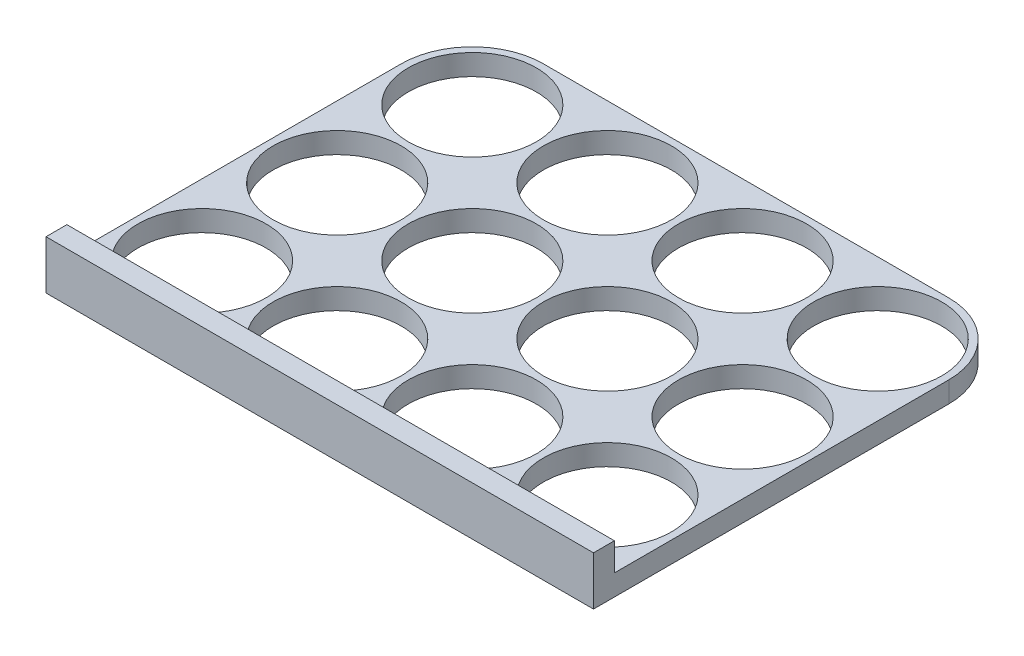
ISO-10303-21;
HEADER;
FILE_DESCRIPTION(('STEP AP214'),'2;1');
FILE_NAME('part.step','',(''),(''),'','','');
FILE_SCHEMA(('AUTOMOTIVE_DESIGN { 1 0 10303 214 1 1 1 1 }'));
ENDSEC;
DATA;
#1=APPLICATION_CONTEXT('core data for automotive mechanical design processes');
#2=APPLICATION_PROTOCOL_DEFINITION('international standard','automotive_design',2000,#1);
#3=PRODUCT_CONTEXT('',#1,'mechanical');
#4=PRODUCT('Part','Part','',(#3));
#5=PRODUCT_RELATED_PRODUCT_CATEGORY('part','',(#4));
#6=PRODUCT_DEFINITION_FORMATION('','',#4);
#7=PRODUCT_DEFINITION_CONTEXT('part definition',#1,'design');
#8=PRODUCT_DEFINITION('design','',#6,#7);
#9=PRODUCT_DEFINITION_SHAPE('','',#8);
#10=(LENGTH_UNIT() NAMED_UNIT(*) SI_UNIT(.MILLI.,.METRE.));
#11=(NAMED_UNIT(*) PLANE_ANGLE_UNIT() SI_UNIT($,.RADIAN.));
#12=(NAMED_UNIT(*) SI_UNIT($,.STERADIAN.) SOLID_ANGLE_UNIT());
#13=UNCERTAINTY_MEASURE_WITH_UNIT(LENGTH_MEASURE(1.E-05),#10,'distance_accuracy_value','');
#14=(GEOMETRIC_REPRESENTATION_CONTEXT(3) GLOBAL_UNCERTAINTY_ASSIGNED_CONTEXT((#13)) GLOBAL_UNIT_ASSIGNED_CONTEXT((#10,
#11,#12)) REPRESENTATION_CONTEXT('',''));
#15=CARTESIAN_POINT('',(0.,0.,0.));
#16=DIRECTION('',(0.,0.,1.));
#17=DIRECTION('',(1.,0.,0.));
#18=AXIS2_PLACEMENT_3D('',#15,#16,#17);
#19=CARTESIAN_POINT('',(-1.33093661156768E-13,3.,-38.8));
#20=DIRECTION('',(0.,-1.,0.));
#21=DIRECTION('',(0.,0.,-1.));
#22=AXIS2_PLACEMENT_3D('',#19,#20,#21);
#23=PLANE('',#22);
#24=CARTESIAN_POINT('',(-1.33093661156768E-13,3.,-38.8));
#25=DIRECTION('',(0.,1.,0.));
#26=DIRECTION('',(0.,0.,1.));
#27=AXIS2_PLACEMENT_3D('',#24,#25,#26);
#28=CIRCLE('',#27,9.2);
#29=CARTESIAN_POINT('',(-1.33093661156768E-13,3.,-29.6));
#30=VERTEX_POINT('',#29);
#31=EDGE_CURVE('E169',#30,#30,#28,.T.);
#32=ORIENTED_EDGE('',*,*,#31,.F.);
#33=EDGE_LOOP('',(#32));
#34=FACE_BOUND('',#33,.T.);
#35=CARTESIAN_POINT('',(0.,3.,-19.4));
#36=DIRECTION('',(0.,1.,0.));
#37=DIRECTION('',(0.,0.,1.));
#38=AXIS2_PLACEMENT_3D('',#35,#36,#37);
#39=CIRCLE('',#38,9.2);
#40=CARTESIAN_POINT('',(0.,3.,-10.2));
#41=VERTEX_POINT('',#40);
#42=EDGE_CURVE('E177',#41,#41,#39,.T.);
#43=ORIENTED_EDGE('',*,*,#42,.F.);
#44=EDGE_LOOP('',(#43));
#45=FACE_BOUND('',#44,.T.);
#46=CARTESIAN_POINT('',(58.1999999999999,3.,-38.8));
#47=DIRECTION('',(0.,1.,0.));
#48=DIRECTION('',(0.,0.,1.));
#49=AXIS2_PLACEMENT_3D('',#46,#47,#48);
#50=CIRCLE('',#49,9.2);
#51=CARTESIAN_POINT('',(58.1999999999999,3.,-29.6));
#52=VERTEX_POINT('',#51);
#53=EDGE_CURVE('E185',#52,#52,#50,.T.);
#54=ORIENTED_EDGE('',*,*,#53,.F.);
#55=EDGE_LOOP('',(#54));
#56=FACE_BOUND('',#55,.T.);
#57=CARTESIAN_POINT('',(38.7999999999999,3.,-38.8));
#58=DIRECTION('',(0.,1.,0.));
#59=DIRECTION('',(0.,0.,1.));
#60=AXIS2_PLACEMENT_3D('',#57,#58,#59);
#61=CIRCLE('',#60,9.2);
#62=CARTESIAN_POINT('',(38.7999999999999,3.,-29.6));
#63=VERTEX_POINT('',#62);
#64=EDGE_CURVE('E193',#63,#63,#61,.T.);
#65=ORIENTED_EDGE('',*,*,#64,.F.);
#66=EDGE_LOOP('',(#65));
#67=FACE_BOUND('',#66,.T.);
#68=CARTESIAN_POINT('',(19.3999999999999,3.,-38.8));
#69=DIRECTION('',(0.,1.,0.));
#70=DIRECTION('',(0.,0.,1.));
#71=AXIS2_PLACEMENT_3D('',#68,#69,#70);
#72=CIRCLE('',#71,9.2);
#73=CARTESIAN_POINT('',(19.3999999999999,3.,-29.6));
#74=VERTEX_POINT('',#73);
#75=EDGE_CURVE('E201',#74,#74,#72,.T.);
#76=ORIENTED_EDGE('',*,*,#75,.F.);
#77=EDGE_LOOP('',(#76));
#78=FACE_BOUND('',#77,.T.);
#79=CARTESIAN_POINT('',(58.1999999999999,3.,-19.4));
#80=DIRECTION('',(0.,1.,0.));
#81=DIRECTION('',(0.,0.,1.));
#82=AXIS2_PLACEMENT_3D('',#79,#80,#81);
#83=CIRCLE('',#82,9.2);
#84=CARTESIAN_POINT('',(58.1999999999999,3.,-10.2));
#85=VERTEX_POINT('',#84);
#86=EDGE_CURVE('E209',#85,#85,#83,.T.);
#87=ORIENTED_EDGE('',*,*,#86,.F.);
#88=EDGE_LOOP('',(#87));
#89=FACE_BOUND('',#88,.T.);
#90=CARTESIAN_POINT('',(38.7999999999999,3.,-19.4));
#91=DIRECTION('',(0.,1.,0.));
#92=DIRECTION('',(0.,0.,1.));
#93=AXIS2_PLACEMENT_3D('',#90,#91,#92);
#94=CIRCLE('',#93,9.2);
#95=CARTESIAN_POINT('',(38.7999999999999,3.,-10.2));
#96=VERTEX_POINT('',#95);
#97=EDGE_CURVE('E217',#96,#96,#94,.T.);
#98=ORIENTED_EDGE('',*,*,#97,.F.);
#99=EDGE_LOOP('',(#98));
#100=FACE_BOUND('',#99,.T.);
#101=CARTESIAN_POINT('',(19.3999999999999,3.,-19.4));
#102=DIRECTION('',(0.,1.,0.));
#103=DIRECTION('',(0.,0.,1.));
#104=AXIS2_PLACEMENT_3D('',#101,#102,#103);
#105=CIRCLE('',#104,9.2);
#106=CARTESIAN_POINT('',(19.3999999999999,3.,-10.2));
#107=VERTEX_POINT('',#106);
#108=EDGE_CURVE('E225',#107,#107,#105,.T.);
#109=ORIENTED_EDGE('',*,*,#108,.F.);
#110=EDGE_LOOP('',(#109));
#111=FACE_BOUND('',#110,.T.);
#112=DIRECTION('',(-1.,0.,0.));
#113=VECTOR('',#112,1.);
#114=CARTESIAN_POINT('',(-10.2000000000001,3.,9.2));
#115=LINE('',#114,#113);
#116=CARTESIAN_POINT('',(68.3999999999999,3.,9.2));
#117=VERTEX_POINT('',#116);
#118=CARTESIAN_POINT('',(58.2,3.,9.2));
#119=VERTEX_POINT('',#118);
#120=EDGE_CURVE('E57',#117,#119,#115,.T.);
#121=ORIENTED_EDGE('',*,*,#120,.F.);
#122=DIRECTION('',(0.,0.,-1.));
#123=VECTOR('',#122,1.);
#124=CARTESIAN_POINT('',(68.3999999999999,3.,12.2));
#125=LINE('',#124,#123);
#126=CARTESIAN_POINT('',(68.3999999999999,3.,-38.8));
#127=VERTEX_POINT('',#126);
#128=EDGE_CURVE('E271',#117,#127,#125,.T.);
#129=ORIENTED_EDGE('',*,*,#128,.T.);
#130=CARTESIAN_POINT('',(58.1999999999999,3.,-38.8));
#131=DIRECTION('',(0.,1.,0.));
#132=DIRECTION('',(0.,0.,-1.));
#133=AXIS2_PLACEMENT_3D('',#130,#131,#132);
#134=CIRCLE('',#133,10.2);
#135=CARTESIAN_POINT('',(58.1999999999999,3.,-49.));
#136=VERTEX_POINT('',#135);
#137=EDGE_CURVE('E274',#127,#136,#134,.T.);
#138=ORIENTED_EDGE('',*,*,#137,.T.);
#139=DIRECTION('',(-1.,0.,0.));
#140=VECTOR('',#139,1.);
#141=CARTESIAN_POINT('',(-1.33093661156768E-13,3.,-49.));
#142=LINE('',#141,#140);
#143=CARTESIAN_POINT('',(-1.33093661156768E-13,3.,-49.));
#144=VERTEX_POINT('',#143);
#145=EDGE_CURVE('E277',#136,#144,#142,.T.);
#146=ORIENTED_EDGE('',*,*,#145,.T.);
#147=CARTESIAN_POINT('',(-1.33093661156768E-13,3.,-38.8));
#148=DIRECTION('',(0.,1.,0.));
#149=DIRECTION('',(0.,0.,-1.));
#150=AXIS2_PLACEMENT_3D('',#147,#148,#149);
#151=CIRCLE('',#150,10.2);
#152=CARTESIAN_POINT('',(-10.2000000000001,3.,-38.8));
#153=VERTEX_POINT('',#152);
#154=EDGE_CURVE('E263',#144,#153,#151,.T.);
#155=ORIENTED_EDGE('',*,*,#154,.T.);
#156=DIRECTION('',(0.,0.,1.));
#157=VECTOR('',#156,1.);
#158=CARTESIAN_POINT('',(-10.2000000000001,3.,-38.8));
#159=LINE('',#158,#157);
#160=CARTESIAN_POINT('',(-10.2000000000001,3.,9.2));
#161=VERTEX_POINT('',#160);
#162=EDGE_CURVE('E267',#153,#161,#159,.T.);
#163=ORIENTED_EDGE('',*,*,#162,.T.);
#164=CARTESIAN_POINT('',(0.,3.,9.2));
#165=VERTEX_POINT('',#164);
#166=EDGE_CURVE('E155',#165,#161,#115,.T.);
#167=ORIENTED_EDGE('',*,*,#166,.F.);
#168=CARTESIAN_POINT('',(0.,3.,0.));
#169=DIRECTION('',(0.,1.,0.));
#170=DIRECTION('',(0.,0.,1.));
#171=AXIS2_PLACEMENT_3D('',#168,#169,#170);
#172=CIRCLE('',#171,9.2);
#173=EDGE_CURVE('E255',#165,#165,#172,.T.);
#174=ORIENTED_EDGE('',*,*,#173,.F.);
#175=CARTESIAN_POINT('',(19.4,3.,9.2));
#176=VERTEX_POINT('',#175);
#177=EDGE_CURVE('E326',#176,#165,#115,.T.);
#178=ORIENTED_EDGE('',*,*,#177,.F.);
#179=CARTESIAN_POINT('',(19.4,3.,0.));
#180=DIRECTION('',(0.,1.,0.));
#181=DIRECTION('',(0.,0.,1.));
#182=AXIS2_PLACEMENT_3D('',#179,#180,#181);
#183=CIRCLE('',#182,9.2);
#184=EDGE_CURVE('E247',#176,#176,#183,.T.);
#185=ORIENTED_EDGE('',*,*,#184,.F.);
#186=CARTESIAN_POINT('',(38.8,3.,9.2));
#187=VERTEX_POINT('',#186);
#188=EDGE_CURVE('E55',#187,#176,#115,.T.);
#189=ORIENTED_EDGE('',*,*,#188,.F.);
#190=CARTESIAN_POINT('',(38.8,3.,0.));
#191=DIRECTION('',(0.,1.,0.));
#192=DIRECTION('',(0.,0.,1.));
#193=AXIS2_PLACEMENT_3D('',#190,#191,#192);
#194=CIRCLE('',#193,9.2);
#195=EDGE_CURVE('E240',#187,#187,#194,.T.);
#196=ORIENTED_EDGE('',*,*,#195,.F.);
#197=EDGE_CURVE('E11',#119,#187,#115,.T.);
#198=ORIENTED_EDGE('',*,*,#197,.F.);
#199=CARTESIAN_POINT('',(58.2,3.,0.));
#200=DIRECTION('',(0.,1.,0.));
#201=DIRECTION('',(0.,0.,1.));
#202=AXIS2_PLACEMENT_3D('',#199,#200,#201);
#203=CIRCLE('',#202,9.2);
#204=EDGE_CURVE('E233',#119,#119,#203,.T.);
#205=ORIENTED_EDGE('',*,*,#204,.F.);
#206=EDGE_LOOP('',(#121,#129,#138,#146,#155,#163,#167,#174,#178,#185,#189,#196,#198,#205));
#207=FACE_BOUND('',#206,.T.);
#208=ADVANCED_FACE('F45',(#34,#45,#56,#67,#78,#89,#100,#111,#207),#23,.F.);
#209=CARTESIAN_POINT('',(-1.33093661156768E-13,0.,-38.8));
#210=DIRECTION('',(0.,-1.,0.));
#211=DIRECTION('',(0.,0.,-1.));
#212=AXIS2_PLACEMENT_3D('',#209,#210,#211);
#213=PLANE('',#212);
#214=CARTESIAN_POINT('',(0.,0.,-19.4));
#215=DIRECTION('',(0.,1.,0.));
#216=DIRECTION('',(0.,0.,1.));
#217=AXIS2_PLACEMENT_3D('',#214,#215,#216);
#218=CIRCLE('',#217,9.2);
#219=CARTESIAN_POINT('',(0.,0.,-10.2));
#220=VERTEX_POINT('',#219);
#221=EDGE_CURVE('E173',#220,#220,#218,.T.);
#222=ORIENTED_EDGE('',*,*,#221,.T.);
#223=EDGE_LOOP('',(#222));
#224=FACE_BOUND('',#223,.T.);
#225=CARTESIAN_POINT('',(38.7999999999999,0.,-38.8));
#226=DIRECTION('',(0.,1.,0.));
#227=DIRECTION('',(0.,0.,1.));
#228=AXIS2_PLACEMENT_3D('',#225,#226,#227);
#229=CIRCLE('',#228,9.2);
#230=CARTESIAN_POINT('',(38.7999999999999,0.,-29.6));
#231=VERTEX_POINT('',#230);
#232=EDGE_CURVE('E189',#231,#231,#229,.T.);
#233=ORIENTED_EDGE('',*,*,#232,.T.);
#234=EDGE_LOOP('',(#233));
#235=FACE_BOUND('',#234,.T.);
#236=CARTESIAN_POINT('',(58.1999999999999,0.,-19.4));
#237=DIRECTION('',(0.,1.,0.));
#238=DIRECTION('',(0.,0.,1.));
#239=AXIS2_PLACEMENT_3D('',#236,#237,#238);
#240=CIRCLE('',#239,9.2);
#241=CARTESIAN_POINT('',(58.1999999999999,0.,-10.2));
#242=VERTEX_POINT('',#241);
#243=EDGE_CURVE('E205',#242,#242,#240,.T.);
#244=ORIENTED_EDGE('',*,*,#243,.T.);
#245=EDGE_LOOP('',(#244));
#246=FACE_BOUND('',#245,.T.);
#247=CARTESIAN_POINT('',(19.3999999999999,0.,-19.4));
#248=DIRECTION('',(0.,1.,0.));
#249=DIRECTION('',(0.,0.,1.));
#250=AXIS2_PLACEMENT_3D('',#247,#248,#249);
#251=CIRCLE('',#250,9.2);
#252=CARTESIAN_POINT('',(19.3999999999999,0.,-10.2));
#253=VERTEX_POINT('',#252);
#254=EDGE_CURVE('E221',#253,#253,#251,.T.);
#255=ORIENTED_EDGE('',*,*,#254,.T.);
#256=EDGE_LOOP('',(#255));
#257=FACE_BOUND('',#256,.T.);
#258=CARTESIAN_POINT('',(38.8,0.,0.));
#259=DIRECTION('',(0.,1.,0.));
#260=DIRECTION('',(0.,0.,1.));
#261=AXIS2_PLACEMENT_3D('',#258,#259,#260);
#262=CIRCLE('',#261,9.2);
#263=CARTESIAN_POINT('',(38.8,0.,9.2));
#264=VERTEX_POINT('',#263);
#265=EDGE_CURVE('E236',#264,#264,#262,.T.);
#266=ORIENTED_EDGE('',*,*,#265,.T.);
#267=EDGE_LOOP('',(#266));
#268=FACE_BOUND('',#267,.T.);
#269=CARTESIAN_POINT('',(0.,0.,0.));
#270=DIRECTION('',(0.,1.,0.));
#271=DIRECTION('',(0.,0.,1.));
#272=AXIS2_PLACEMENT_3D('',#269,#270,#271);
#273=CIRCLE('',#272,9.2);
#274=CARTESIAN_POINT('',(0.,0.,9.2));
#275=VERTEX_POINT('',#274);
#276=EDGE_CURVE('E251',#275,#275,#273,.T.);
#277=ORIENTED_EDGE('',*,*,#276,.T.);
#278=EDGE_LOOP('',(#277));
#279=FACE_BOUND('',#278,.T.);
#280=CARTESIAN_POINT('',(-1.33093661156768E-13,0.,-38.8));
#281=DIRECTION('',(0.,1.,0.));
#282=DIRECTION('',(0.,0.,-1.));
#283=AXIS2_PLACEMENT_3D('',#280,#281,#282);
#284=CIRCLE('',#283,10.2);
#285=CARTESIAN_POINT('',(-1.33093661156768E-13,0.,-49.));
#286=VERTEX_POINT('',#285);
#287=CARTESIAN_POINT('',(-10.2000000000001,0.,-38.8));
#288=VERTEX_POINT('',#287);
#289=EDGE_CURVE('E259',#286,#288,#284,.T.);
#290=ORIENTED_EDGE('',*,*,#289,.F.);
#291=DIRECTION('',(-1.,0.,0.));
#292=VECTOR('',#291,1.);
#293=CARTESIAN_POINT('',(-1.33093661156768E-13,0.,-49.));
#294=LINE('',#293,#292);
#295=CARTESIAN_POINT('',(58.1999999999999,0.,-49.));
#296=VERTEX_POINT('',#295);
#297=EDGE_CURVE('E268',#296,#286,#294,.T.);
#298=ORIENTED_EDGE('',*,*,#297,.F.);
#299=CARTESIAN_POINT('',(58.1999999999999,0.,-38.8));
#300=DIRECTION('',(0.,1.,0.));
#301=DIRECTION('',(0.,0.,-1.));
#302=AXIS2_PLACEMENT_3D('',#299,#300,#301);
#303=CIRCLE('',#302,10.2);
#304=CARTESIAN_POINT('',(68.3999999999999,0.,-38.8));
#305=VERTEX_POINT('',#304);
#306=EDGE_CURVE('E292',#305,#296,#303,.T.);
#307=ORIENTED_EDGE('',*,*,#306,.F.);
#308=DIRECTION('',(0.,0.,-1.));
#309=VECTOR('',#308,1.);
#310=CARTESIAN_POINT('',(68.3999999999999,0.,-38.8));
#311=LINE('',#310,#309);
#312=CARTESIAN_POINT('',(68.3999999999999,0.,12.2));
#313=VERTEX_POINT('',#312);
#314=EDGE_CURVE('E289',#313,#305,#311,.T.);
#315=ORIENTED_EDGE('',*,*,#314,.F.);
#316=DIRECTION('',(1.,0.,0.));
#317=VECTOR('',#316,1.);
#318=CARTESIAN_POINT('',(-10.2000000000001,0.,12.2));
#319=LINE('',#318,#317);
#320=CARTESIAN_POINT('',(-10.2000000000001,0.,12.2));
#321=VERTEX_POINT('',#320);
#322=EDGE_CURVE('E286',#321,#313,#319,.T.);
#323=ORIENTED_EDGE('',*,*,#322,.F.);
#324=DIRECTION('',(0.,0.,1.));
#325=VECTOR('',#324,1.);
#326=CARTESIAN_POINT('',(-10.2000000000001,0.,0.));
#327=LINE('',#326,#325);
#328=EDGE_CURVE('E132',#288,#321,#327,.T.);
#329=ORIENTED_EDGE('',*,*,#328,.F.);
#330=EDGE_LOOP('',(#290,#298,#307,#315,#323,#329));
#331=FACE_BOUND('',#330,.T.);
#332=CARTESIAN_POINT('',(19.4,0.,0.));
#333=DIRECTION('',(0.,1.,0.));
#334=DIRECTION('',(0.,0.,1.));
#335=AXIS2_PLACEMENT_3D('',#332,#333,#334);
#336=CIRCLE('',#335,9.2);
#337=CARTESIAN_POINT('',(19.4,0.,9.2));
#338=VERTEX_POINT('',#337);
#339=EDGE_CURVE('E243',#338,#338,#336,.T.);
#340=ORIENTED_EDGE('',*,*,#339,.T.);
#341=EDGE_LOOP('',(#340));
#342=FACE_BOUND('',#341,.T.);
#343=CARTESIAN_POINT('',(58.2,0.,0.));
#344=DIRECTION('',(0.,1.,0.));
#345=DIRECTION('',(0.,0.,1.));
#346=AXIS2_PLACEMENT_3D('',#343,#344,#345);
#347=CIRCLE('',#346,9.2);
#348=CARTESIAN_POINT('',(58.2,0.,9.2));
#349=VERTEX_POINT('',#348);
#350=EDGE_CURVE('E229',#349,#349,#347,.T.);
#351=ORIENTED_EDGE('',*,*,#350,.T.);
#352=EDGE_LOOP('',(#351));
#353=FACE_BOUND('',#352,.T.);
#354=CARTESIAN_POINT('',(38.7999999999999,0.,-19.4));
#355=DIRECTION('',(0.,1.,0.));
#356=DIRECTION('',(0.,0.,1.));
#357=AXIS2_PLACEMENT_3D('',#354,#355,#356);
#358=CIRCLE('',#357,9.2);
#359=CARTESIAN_POINT('',(38.7999999999999,0.,-10.2));
#360=VERTEX_POINT('',#359);
#361=EDGE_CURVE('E213',#360,#360,#358,.T.);
#362=ORIENTED_EDGE('',*,*,#361,.T.);
#363=EDGE_LOOP('',(#362));
#364=FACE_BOUND('',#363,.T.);
#365=CARTESIAN_POINT('',(19.3999999999999,0.,-38.8));
#366=DIRECTION('',(0.,1.,0.));
#367=DIRECTION('',(0.,0.,1.));
#368=AXIS2_PLACEMENT_3D('',#365,#366,#367);
#369=CIRCLE('',#368,9.2);
#370=CARTESIAN_POINT('',(19.3999999999999,0.,-29.6));
#371=VERTEX_POINT('',#370);
#372=EDGE_CURVE('E197',#371,#371,#369,.T.);
#373=ORIENTED_EDGE('',*,*,#372,.T.);
#374=EDGE_LOOP('',(#373));
#375=FACE_BOUND('',#374,.T.);
#376=CARTESIAN_POINT('',(58.1999999999999,0.,-38.8));
#377=DIRECTION('',(0.,1.,0.));
#378=DIRECTION('',(0.,0.,1.));
#379=AXIS2_PLACEMENT_3D('',#376,#377,#378);
#380=CIRCLE('',#379,9.2);
#381=CARTESIAN_POINT('',(58.1999999999999,0.,-29.6));
#382=VERTEX_POINT('',#381);
#383=EDGE_CURVE('E181',#382,#382,#380,.T.);
#384=ORIENTED_EDGE('',*,*,#383,.T.);
#385=EDGE_LOOP('',(#384));
#386=FACE_BOUND('',#385,.T.);
#387=CARTESIAN_POINT('',(-1.33093661156768E-13,0.,-38.8));
#388=DIRECTION('',(0.,1.,0.));
#389=DIRECTION('',(0.,0.,1.));
#390=AXIS2_PLACEMENT_3D('',#387,#388,#389);
#391=CIRCLE('',#390,9.2);
#392=CARTESIAN_POINT('',(-1.33093661156768E-13,0.,-29.6));
#393=VERTEX_POINT('',#392);
#394=EDGE_CURVE('E168',#393,#393,#391,.T.);
#395=ORIENTED_EDGE('',*,*,#394,.T.);
#396=EDGE_LOOP('',(#395));
#397=FACE_BOUND('',#396,.T.);
#398=ADVANCED_FACE('F338',(#224,#235,#246,#257,#268,#279,#331,#342,#353,#364,#375,#386,#397),
#213,.T.);
#399=CARTESIAN_POINT('',(-1.33093661156768E-13,3.,-38.8));
#400=DIRECTION('',(0.,-1.,0.));
#401=DIRECTION('',(0.,0.,-1.));
#402=AXIS2_PLACEMENT_3D('',#399,#400,#401);
#403=CYLINDRICAL_SURFACE('',#402,10.2);
#404=ORIENTED_EDGE('',*,*,#289,.T.);
#405=DIRECTION('',(0.,-1.,0.));
#406=VECTOR('',#405,1.);
#407=CARTESIAN_POINT('',(-10.2000000000001,3.,-38.8));
#408=LINE('',#407,#406);
#409=EDGE_CURVE('E49',#153,#288,#408,.T.);
#410=ORIENTED_EDGE('',*,*,#409,.F.);
#411=ORIENTED_EDGE('',*,*,#154,.F.);
#412=DIRECTION('',(0.,-1.,0.));
#413=VECTOR('',#412,1.);
#414=CARTESIAN_POINT('',(-1.33093661156768E-13,3.,-49.));
#415=LINE('',#414,#413);
#416=EDGE_CURVE('E280',#144,#286,#415,.T.);
#417=ORIENTED_EDGE('',*,*,#416,.T.);
#418=EDGE_LOOP('',(#404,#410,#411,#417));
#419=FACE_BOUND('',#418,.T.);
#420=ADVANCED_FACE('F47',(#419),#403,.T.);
#421=CARTESIAN_POINT('',(-10.2000000000001,3.,0.));
#422=DIRECTION('',(1.,0.,0.));
#423=DIRECTION('',(0.,0.,-1.));
#424=AXIS2_PLACEMENT_3D('',#421,#422,#423);
#425=PLANE('',#424);
#426=ORIENTED_EDGE('',*,*,#328,.T.);
#427=DIRECTION('',(0.,-1.,0.));
#428=VECTOR('',#427,1.);
#429=CARTESIAN_POINT('',(-10.2000000000001,3.,12.2));
#430=LINE('',#429,#428);
#431=CARTESIAN_POINT('',(-10.2000000000001,7.,12.2));
#432=VERTEX_POINT('',#431);
#433=EDGE_CURVE('E125',#432,#321,#430,.T.);
#434=ORIENTED_EDGE('',*,*,#433,.F.);
#435=DIRECTION('',(0.,0.,1.));
#436=VECTOR('',#435,1.);
#437=CARTESIAN_POINT('',(-10.2000000000001,7.,12.2));
#438=LINE('',#437,#436);
#439=CARTESIAN_POINT('',(-10.2000000000001,7.,9.2));
#440=VERTEX_POINT('',#439);
#441=EDGE_CURVE('E130',#440,#432,#438,.T.);
#442=ORIENTED_EDGE('',*,*,#441,.F.);
#443=DIRECTION('',(0.,-1.,0.));
#444=VECTOR('',#443,1.);
#445=CARTESIAN_POINT('',(-10.2000000000001,7.,9.2));
#446=LINE('',#445,#444);
#447=EDGE_CURVE('E160',#440,#161,#446,.T.);
#448=ORIENTED_EDGE('',*,*,#447,.T.);
#449=ORIENTED_EDGE('',*,*,#162,.F.);
#450=ORIENTED_EDGE('',*,*,#409,.T.);
#451=EDGE_LOOP('',(#426,#434,#442,#448,#449,#450));
#452=FACE_BOUND('',#451,.T.);
#453=ADVANCED_FACE('F127',(#452),#425,.F.);
#454=CARTESIAN_POINT('',(-10.2000000000001,3.,12.2));
#455=DIRECTION('',(0.,0.,-1.));
#456=DIRECTION('',(-1.,0.,0.));
#457=AXIS2_PLACEMENT_3D('',#454,#455,#456);
#458=PLANE('',#457);
#459=ORIENTED_EDGE('',*,*,#322,.T.);
#460=DIRECTION('',(0.,-1.,0.));
#461=VECTOR('',#460,1.);
#462=CARTESIAN_POINT('',(68.3999999999999,3.,12.2));
#463=LINE('',#462,#461);
#464=CARTESIAN_POINT('',(68.3999999999999,7.,12.2));
#465=VERTEX_POINT('',#464);
#466=EDGE_CURVE('E137',#465,#313,#463,.T.);
#467=ORIENTED_EDGE('',*,*,#466,.F.);
#468=DIRECTION('',(1.,0.,0.));
#469=VECTOR('',#468,1.);
#470=CARTESIAN_POINT('',(-10.2000000000001,7.,12.2));
#471=LINE('',#470,#469);
#472=EDGE_CURVE('E139',#432,#465,#471,.T.);
#473=ORIENTED_EDGE('',*,*,#472,.F.);
#474=ORIENTED_EDGE('',*,*,#433,.T.);
#475=EDGE_LOOP('',(#459,#467,#473,#474));
#476=FACE_BOUND('',#475,.T.);
#477=ADVANCED_FACE('F140',(#476),#458,.F.);
#478=CARTESIAN_POINT('',(68.3999999999999,3.,-38.8));
#479=DIRECTION('',(-1.,0.,0.));
#480=DIRECTION('',(0.,0.,1.));
#481=AXIS2_PLACEMENT_3D('',#478,#479,#480);
#482=PLANE('',#481);
#483=ORIENTED_EDGE('',*,*,#314,.T.);
#484=DIRECTION('',(0.,-1.,0.));
#485=VECTOR('',#484,1.);
#486=CARTESIAN_POINT('',(68.3999999999999,3.,-38.8));
#487=LINE('',#486,#485);
#488=EDGE_CURVE('E304',#127,#305,#487,.T.);
#489=ORIENTED_EDGE('',*,*,#488,.F.);
#490=ORIENTED_EDGE('',*,*,#128,.F.);
#491=DIRECTION('',(0.,-1.,0.));
#492=VECTOR('',#491,1.);
#493=CARTESIAN_POINT('',(68.3999999999999,7.,9.2));
#494=LINE('',#493,#492);
#495=CARTESIAN_POINT('',(68.3999999999999,7.,9.2));
#496=VERTEX_POINT('',#495);
#497=EDGE_CURVE('E164',#496,#117,#494,.T.);
#498=ORIENTED_EDGE('',*,*,#497,.F.);
#499=DIRECTION('',(0.,0.,-1.));
#500=VECTOR('',#499,1.);
#501=CARTESIAN_POINT('',(68.3999999999999,7.,12.2));
#502=LINE('',#501,#500);
#503=EDGE_CURVE('E145',#465,#496,#502,.T.);
#504=ORIENTED_EDGE('',*,*,#503,.F.);
#505=ORIENTED_EDGE('',*,*,#466,.T.);
#506=EDGE_LOOP('',(#483,#489,#490,#498,#504,#505));
#507=FACE_BOUND('',#506,.T.);
#508=ADVANCED_FACE('F310',(#507),#482,.F.);
#509=CARTESIAN_POINT('',(58.1999999999999,3.,-38.8));
#510=DIRECTION('',(0.,-1.,0.));
#511=DIRECTION('',(0.,0.,-1.));
#512=AXIS2_PLACEMENT_3D('',#509,#510,#511);
#513=CYLINDRICAL_SURFACE('',#512,10.2);
#514=ORIENTED_EDGE('',*,*,#306,.T.);
#515=DIRECTION('',(0.,-1.,0.));
#516=VECTOR('',#515,1.);
#517=CARTESIAN_POINT('',(58.1999999999999,3.,-49.));
#518=LINE('',#517,#516);
#519=EDGE_CURVE('E300',#136,#296,#518,.T.);
#520=ORIENTED_EDGE('',*,*,#519,.F.);
#521=ORIENTED_EDGE('',*,*,#137,.F.);
#522=ORIENTED_EDGE('',*,*,#488,.T.);
#523=EDGE_LOOP('',(#514,#520,#521,#522));
#524=FACE_BOUND('',#523,.T.);
#525=ADVANCED_FACE('F378',(#524),#513,.T.);
#526=CARTESIAN_POINT('',(-1.33093661156768E-13,3.,-49.));
#527=DIRECTION('',(0.,0.,1.));
#528=DIRECTION('',(1.,0.,0.));
#529=AXIS2_PLACEMENT_3D('',#526,#527,#528);
#530=PLANE('',#529);
#531=ORIENTED_EDGE('',*,*,#297,.T.);
#532=ORIENTED_EDGE('',*,*,#416,.F.);
#533=ORIENTED_EDGE('',*,*,#145,.F.);
#534=ORIENTED_EDGE('',*,*,#519,.T.);
#535=EDGE_LOOP('',(#531,#532,#533,#534));
#536=FACE_BOUND('',#535,.T.);
#537=ADVANCED_FACE('F375',(#536),#530,.F.);
#538=CARTESIAN_POINT('',(0.,3.,0.));
#539=DIRECTION('',(0.,-1.,0.));
#540=DIRECTION('',(0.,0.,-1.));
#541=AXIS2_PLACEMENT_3D('',#538,#539,#540);
#542=CYLINDRICAL_SURFACE('',#541,9.2);
#543=ORIENTED_EDGE('',*,*,#173,.T.);
#544=EDGE_LOOP('',(#543));
#545=FACE_BOUND('',#544,.T.);
#546=ORIENTED_EDGE('',*,*,#276,.F.);
#547=EDGE_LOOP('',(#546));
#548=FACE_BOUND('',#547,.T.);
#549=ADVANCED_FACE('F372',(#545,#548),#542,.F.);
#550=CARTESIAN_POINT('',(19.4,3.,0.));
#551=DIRECTION('',(0.,-1.,0.));
#552=DIRECTION('',(0.,0.,-1.));
#553=AXIS2_PLACEMENT_3D('',#550,#551,#552);
#554=CYLINDRICAL_SURFACE('',#553,9.2);
#555=ORIENTED_EDGE('',*,*,#184,.T.);
#556=EDGE_LOOP('',(#555));
#557=FACE_BOUND('',#556,.T.);
#558=ORIENTED_EDGE('',*,*,#339,.F.);
#559=EDGE_LOOP('',(#558));
#560=FACE_BOUND('',#559,.T.);
#561=ADVANCED_FACE('F443',(#557,#560),#554,.F.);
#562=CARTESIAN_POINT('',(38.8,3.,0.));
#563=DIRECTION('',(0.,-1.,0.));
#564=DIRECTION('',(0.,0.,-1.));
#565=AXIS2_PLACEMENT_3D('',#562,#563,#564);
#566=CYLINDRICAL_SURFACE('',#565,9.2);
#567=ORIENTED_EDGE('',*,*,#195,.T.);
#568=EDGE_LOOP('',(#567));
#569=FACE_BOUND('',#568,.T.);
#570=ORIENTED_EDGE('',*,*,#265,.F.);
#571=EDGE_LOOP('',(#570));
#572=FACE_BOUND('',#571,.T.);
#573=ADVANCED_FACE('F334',(#569,#572),#566,.F.);
#574=CARTESIAN_POINT('',(58.2,3.,0.));
#575=DIRECTION('',(0.,-1.,0.));
#576=DIRECTION('',(0.,0.,-1.));
#577=AXIS2_PLACEMENT_3D('',#574,#575,#576);
#578=CYLINDRICAL_SURFACE('',#577,9.2);
#579=ORIENTED_EDGE('',*,*,#204,.T.);
#580=EDGE_LOOP('',(#579));
#581=FACE_BOUND('',#580,.T.);
#582=ORIENTED_EDGE('',*,*,#350,.F.);
#583=EDGE_LOOP('',(#582));
#584=FACE_BOUND('',#583,.T.);
#585=ADVANCED_FACE('F330',(#581,#584),#578,.F.);
#586=CARTESIAN_POINT('',(19.3999999999999,3.,-19.4));
#587=DIRECTION('',(0.,-1.,0.));
#588=DIRECTION('',(0.,0.,-1.));
#589=AXIS2_PLACEMENT_3D('',#586,#587,#588);
#590=CYLINDRICAL_SURFACE('',#589,9.2);
#591=ORIENTED_EDGE('',*,*,#108,.T.);
#592=EDGE_LOOP('',(#591));
#593=FACE_BOUND('',#592,.T.);
#594=ORIENTED_EDGE('',*,*,#254,.F.);
#595=EDGE_LOOP('',(#594));
#596=FACE_BOUND('',#595,.T.);
#597=ADVANCED_FACE('F333',(#593,#596),#590,.F.);
#598=CARTESIAN_POINT('',(38.7999999999999,3.,-19.4));
#599=DIRECTION('',(0.,-1.,0.));
#600=DIRECTION('',(0.,0.,-1.));
#601=AXIS2_PLACEMENT_3D('',#598,#599,#600);
#602=CYLINDRICAL_SURFACE('',#601,9.2);
#603=ORIENTED_EDGE('',*,*,#97,.T.);
#604=EDGE_LOOP('',(#603));
#605=FACE_BOUND('',#604,.T.);
#606=ORIENTED_EDGE('',*,*,#361,.F.);
#607=EDGE_LOOP('',(#606));
#608=FACE_BOUND('',#607,.T.);
#609=ADVANCED_FACE('F542',(#605,#608),#602,.F.);
#610=CARTESIAN_POINT('',(58.1999999999999,3.,-19.4));
#611=DIRECTION('',(0.,-1.,0.));
#612=DIRECTION('',(0.,0.,-1.));
#613=AXIS2_PLACEMENT_3D('',#610,#611,#612);
#614=CYLINDRICAL_SURFACE('',#613,9.2);
#615=ORIENTED_EDGE('',*,*,#86,.T.);
#616=EDGE_LOOP('',(#615));
#617=FACE_BOUND('',#616,.T.);
#618=ORIENTED_EDGE('',*,*,#243,.F.);
#619=EDGE_LOOP('',(#618));
#620=FACE_BOUND('',#619,.T.);
#621=ADVANCED_FACE('F532',(#617,#620),#614,.F.);
#622=CARTESIAN_POINT('',(19.3999999999999,3.,-38.8));
#623=DIRECTION('',(0.,-1.,0.));
#624=DIRECTION('',(0.,0.,-1.));
#625=AXIS2_PLACEMENT_3D('',#622,#623,#624);
#626=CYLINDRICAL_SURFACE('',#625,9.2);
#627=ORIENTED_EDGE('',*,*,#75,.T.);
#628=EDGE_LOOP('',(#627));
#629=FACE_BOUND('',#628,.T.);
#630=ORIENTED_EDGE('',*,*,#372,.F.);
#631=EDGE_LOOP('',(#630));
#632=FACE_BOUND('',#631,.T.);
#633=ADVANCED_FACE('F522',(#629,#632),#626,.F.);
#634=CARTESIAN_POINT('',(38.7999999999999,3.,-38.8));
#635=DIRECTION('',(0.,-1.,0.));
#636=DIRECTION('',(0.,0.,-1.));
#637=AXIS2_PLACEMENT_3D('',#634,#635,#636);
#638=CYLINDRICAL_SURFACE('',#637,9.2);
#639=ORIENTED_EDGE('',*,*,#64,.T.);
#640=EDGE_LOOP('',(#639));
#641=FACE_BOUND('',#640,.T.);
#642=ORIENTED_EDGE('',*,*,#232,.F.);
#643=EDGE_LOOP('',(#642));
#644=FACE_BOUND('',#643,.T.);
#645=ADVANCED_FACE('F512',(#641,#644),#638,.F.);
#646=CARTESIAN_POINT('',(58.1999999999999,3.,-38.8));
#647=DIRECTION('',(0.,-1.,0.));
#648=DIRECTION('',(0.,0.,-1.));
#649=AXIS2_PLACEMENT_3D('',#646,#647,#648);
#650=CYLINDRICAL_SURFACE('',#649,9.2);
#651=ORIENTED_EDGE('',*,*,#53,.T.);
#652=EDGE_LOOP('',(#651));
#653=FACE_BOUND('',#652,.T.);
#654=ORIENTED_EDGE('',*,*,#383,.F.);
#655=EDGE_LOOP('',(#654));
#656=FACE_BOUND('',#655,.T.);
#657=ADVANCED_FACE('F361',(#653,#656),#650,.F.);
#658=CARTESIAN_POINT('',(0.,3.,-19.4));
#659=DIRECTION('',(0.,-1.,0.));
#660=DIRECTION('',(0.,0.,-1.));
#661=AXIS2_PLACEMENT_3D('',#658,#659,#660);
#662=CYLINDRICAL_SURFACE('',#661,9.2);
#663=ORIENTED_EDGE('',*,*,#42,.T.);
#664=EDGE_LOOP('',(#663));
#665=FACE_BOUND('',#664,.T.);
#666=ORIENTED_EDGE('',*,*,#221,.F.);
#667=EDGE_LOOP('',(#666));
#668=FACE_BOUND('',#667,.T.);
#669=ADVANCED_FACE('F353',(#665,#668),#662,.F.);
#670=CARTESIAN_POINT('',(-1.33093661156768E-13,3.,-38.8));
#671=DIRECTION('',(0.,-1.,0.));
#672=DIRECTION('',(0.,0.,-1.));
#673=AXIS2_PLACEMENT_3D('',#670,#671,#672);
#674=CYLINDRICAL_SURFACE('',#673,9.2);
#675=ORIENTED_EDGE('',*,*,#31,.T.);
#676=EDGE_LOOP('',(#675));
#677=FACE_BOUND('',#676,.T.);
#678=ORIENTED_EDGE('',*,*,#394,.F.);
#679=EDGE_LOOP('',(#678));
#680=FACE_BOUND('',#679,.T.);
#681=ADVANCED_FACE('F351',(#677,#680),#674,.F.);
#682=CARTESIAN_POINT('',(-10.2000000000001,7.,9.2));
#683=DIRECTION('',(0.,0.,1.));
#684=DIRECTION('',(1.,0.,0.));
#685=AXIS2_PLACEMENT_3D('',#682,#683,#684);
#686=PLANE('',#685);
#687=ORIENTED_EDGE('',*,*,#120,.T.);
#688=ORIENTED_EDGE('',*,*,#197,.T.);
#689=ORIENTED_EDGE('',*,*,#188,.T.);
#690=ORIENTED_EDGE('',*,*,#177,.T.);
#691=ORIENTED_EDGE('',*,*,#166,.T.);
#692=ORIENTED_EDGE('',*,*,#447,.F.);
#693=DIRECTION('',(-1.,0.,0.));
#694=VECTOR('',#693,1.);
#695=CARTESIAN_POINT('',(-10.2000000000001,7.,9.2));
#696=LINE('',#695,#694);
#697=EDGE_CURVE('E149',#496,#440,#696,.T.);
#698=ORIENTED_EDGE('',*,*,#697,.F.);
#699=ORIENTED_EDGE('',*,*,#497,.T.);
#700=EDGE_LOOP('',(#687,#688,#689,#690,#691,#692,#698,#699));
#701=FACE_BOUND('',#700,.T.);
#702=ADVANCED_FACE('F315',(#701),#686,.F.);
#703=CARTESIAN_POINT('',(0.,7.,0.));
#704=DIRECTION('',(0.,-1.,0.));
#705=DIRECTION('',(0.,0.,-1.));
#706=AXIS2_PLACEMENT_3D('',#703,#704,#705);
#707=PLANE('',#706);
#708=ORIENTED_EDGE('',*,*,#441,.T.);
#709=ORIENTED_EDGE('',*,*,#472,.T.);
#710=ORIENTED_EDGE('',*,*,#503,.T.);
#711=ORIENTED_EDGE('',*,*,#697,.T.);
#712=EDGE_LOOP('',(#708,#709,#710,#711));
#713=FACE_BOUND('',#712,.T.);
#714=ADVANCED_FACE('F147',(#713),#707,.F.);
#715=CLOSED_SHELL('',(#208,#398,#420,#453,#477,#508,#525,#537,#549,#561,#573,#585,#597,#609,
#621,#633,#645,#657,#669,#681,#702,#714));
#716=MANIFOLD_SOLID_BREP('B2',#715);
#717=ADVANCED_BREP_SHAPE_REPRESENTATION('',(#18,#716),#14);
#718=SHAPE_DEFINITION_REPRESENTATION(#9,#717);
ENDSEC;
END-ISO-10303-21;
